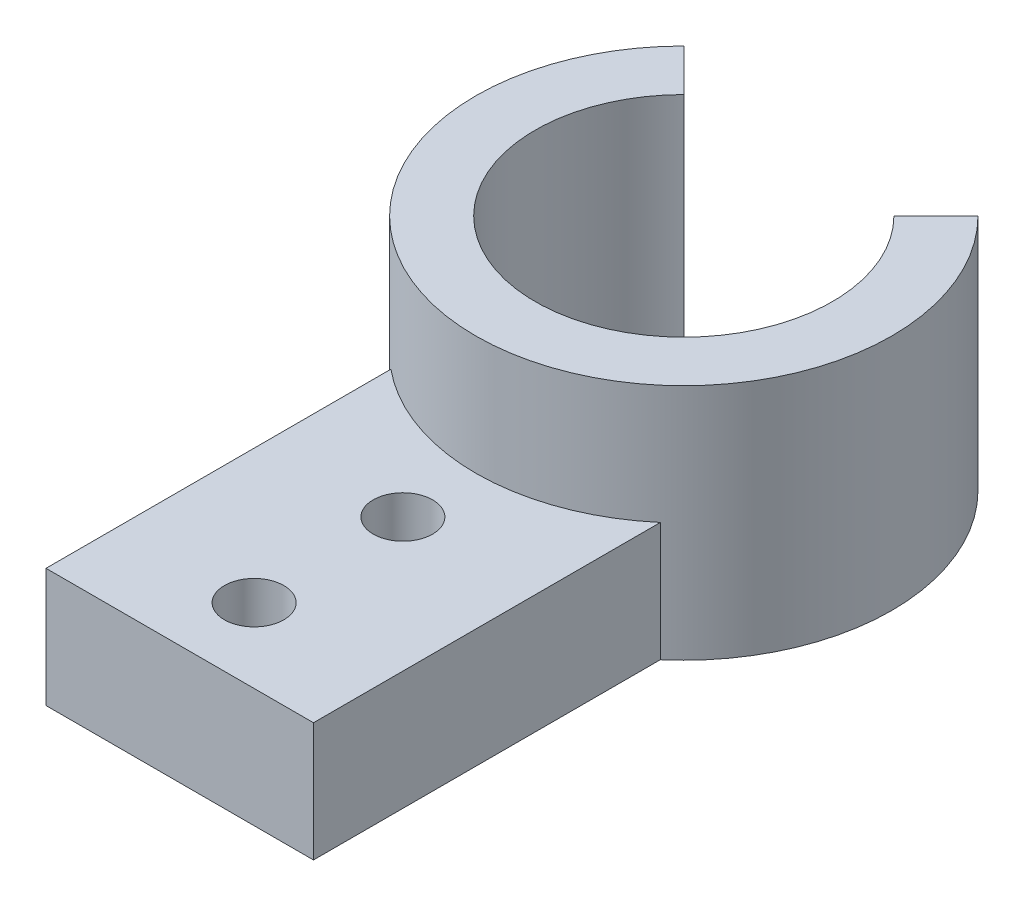
ISO-10303-21;
HEADER;
FILE_DESCRIPTION(('STEP AP214'),'2;1');
FILE_NAME('part.step','',(''),(''),'','','');
FILE_SCHEMA(('AUTOMOTIVE_DESIGN { 1 0 10303 214 1 1 1 1 }'));
ENDSEC;
DATA;
#1=APPLICATION_CONTEXT('core data for automotive mechanical design processes');
#2=APPLICATION_PROTOCOL_DEFINITION('international standard','automotive_design',2000,#1);
#3=PRODUCT_CONTEXT('',#1,'mechanical');
#4=PRODUCT('Part','Part','',(#3));
#5=PRODUCT_RELATED_PRODUCT_CATEGORY('part','',(#4));
#6=PRODUCT_DEFINITION_FORMATION('','',#4);
#7=PRODUCT_DEFINITION_CONTEXT('part definition',#1,'design');
#8=PRODUCT_DEFINITION('design','',#6,#7);
#9=PRODUCT_DEFINITION_SHAPE('','',#8);
#10=(LENGTH_UNIT() NAMED_UNIT(*) SI_UNIT(.MILLI.,.METRE.));
#11=(NAMED_UNIT(*) PLANE_ANGLE_UNIT() SI_UNIT($,.RADIAN.));
#12=(NAMED_UNIT(*) SI_UNIT($,.STERADIAN.) SOLID_ANGLE_UNIT());
#13=UNCERTAINTY_MEASURE_WITH_UNIT(LENGTH_MEASURE(1.E-05),#10,'distance_accuracy_value','');
#14=(GEOMETRIC_REPRESENTATION_CONTEXT(3) GLOBAL_UNCERTAINTY_ASSIGNED_CONTEXT((#13)) GLOBAL_UNIT_ASSIGNED_CONTEXT((#10,
#11,#12)) REPRESENTATION_CONTEXT('',''));
#15=CARTESIAN_POINT('',(0.,0.,0.));
#16=DIRECTION('',(0.,0.,1.));
#17=DIRECTION('',(1.,0.,0.));
#18=AXIS2_PLACEMENT_3D('',#15,#16,#17);
#19=CARTESIAN_POINT('',(0.,8.,0.));
#20=DIRECTION('',(0.,-1.,0.));
#21=DIRECTION('',(0.,0.,-1.));
#22=AXIS2_PLACEMENT_3D('',#19,#20,#21);
#23=CYLINDRICAL_SURFACE('',#22,7.);
#24=DIRECTION('',(0.,-1.,0.));
#25=VECTOR('',#24,1.);
#26=CARTESIAN_POINT('',(4.5396703691316,8.,5.32835743354634));
#27=LINE('',#26,#25);
#28=CARTESIAN_POINT('',(4.5396703691316,0.,5.32835743354634));
#29=VERTEX_POINT('',#28);
#30=CARTESIAN_POINT('',(4.5396703691316,4.,5.32835743354634));
#31=VERTEX_POINT('',#30);
#32=EDGE_CURVE('E134',#29,#31,#27,.F.);
#33=ORIENTED_EDGE('',*,*,#32,.F.);
#34=CARTESIAN_POINT('',(0.,0.,0.));
#35=DIRECTION('',(0.,1.,0.));
#36=DIRECTION('',(0.,0.,1.));
#37=AXIS2_PLACEMENT_3D('',#34,#35,#36);
#38=CIRCLE('',#37,7.);
#39=CARTESIAN_POINT('',(4.94974746830581,0.,-4.94974746830586));
#40=VERTEX_POINT('',#39);
#41=EDGE_CURVE('E156',#29,#40,#38,.T.);
#42=ORIENTED_EDGE('',*,*,#41,.T.);
#43=DIRECTION('',(0.,-1.,0.));
#44=VECTOR('',#43,1.);
#45=CARTESIAN_POINT('',(4.94974746830581,8.,-4.94974746830586));
#46=LINE('',#45,#44);
#47=CARTESIAN_POINT('',(4.94974746830581,8.,-4.94974746830586));
#48=VERTEX_POINT('',#47);
#49=EDGE_CURVE('E149',#40,#48,#46,.F.);
#50=ORIENTED_EDGE('',*,*,#49,.T.);
#51=CARTESIAN_POINT('',(0.,8.,0.));
#52=DIRECTION('',(0.,1.,0.));
#53=DIRECTION('',(0.,0.,1.));
#54=AXIS2_PLACEMENT_3D('',#51,#52,#53);
#55=CIRCLE('',#54,7.);
#56=CARTESIAN_POINT('',(-4.94974746830586,8.,-4.94974746830581));
#57=VERTEX_POINT('',#56);
#58=EDGE_CURVE('E158',#57,#48,#55,.T.);
#59=ORIENTED_EDGE('',*,*,#58,.F.);
#60=DIRECTION('',(0.,-1.,0.));
#61=VECTOR('',#60,1.);
#62=CARTESIAN_POINT('',(-4.94974746830586,8.,-4.94974746830581));
#63=LINE('',#62,#61);
#64=CARTESIAN_POINT('',(-4.94974746830586,0.,-4.94974746830581));
#65=VERTEX_POINT('',#64);
#66=EDGE_CURVE('E144',#57,#65,#63,.T.);
#67=ORIENTED_EDGE('',*,*,#66,.T.);
#68=CARTESIAN_POINT('',(-4.4603296308684,0.,5.39494759789169));
#69=VERTEX_POINT('',#68);
#70=EDGE_CURVE('E161',#65,#69,#38,.T.);
#71=ORIENTED_EDGE('',*,*,#70,.T.);
#72=DIRECTION('',(0.,-1.,0.));
#73=VECTOR('',#72,1.);
#74=CARTESIAN_POINT('',(-4.4603296308684,8.,5.3949475978917));
#75=LINE('',#74,#73);
#76=CARTESIAN_POINT('',(-4.4603296308684,4.,5.3949475978917));
#77=VERTEX_POINT('',#76);
#78=EDGE_CURVE('E132',#77,#69,#75,.T.);
#79=ORIENTED_EDGE('',*,*,#78,.F.);
#80=CARTESIAN_POINT('',(0.,4.,0.));
#81=DIRECTION('',(0.,-1.,0.));
#82=DIRECTION('',(0.,0.,-1.));
#83=AXIS2_PLACEMENT_3D('',#80,#81,#82);
#84=CIRCLE('',#83,7.);
#85=EDGE_CURVE('E51',#31,#77,#84,.T.);
#86=ORIENTED_EDGE('',*,*,#85,.F.);
#87=EDGE_LOOP('',(#33,#42,#50,#59,#67,#71,#79,#86));
#88=FACE_BOUND('',#87,.T.);
#89=ADVANCED_FACE('F37',(#88),#23,.T.);
#90=CARTESIAN_POINT('',(0.,8.,0.));
#91=DIRECTION('',(0.,1.,0.));
#92=DIRECTION('',(0.,0.,1.));
#93=AXIS2_PLACEMENT_3D('',#90,#91,#92);
#94=PLANE('',#93);
#95=DIRECTION('',(0.707106781186544,0.,-0.707106781186551));
#96=VECTOR('',#95,1.);
#97=CARTESIAN_POINT('',(8.5264457854819,8.,-8.52644578548199));
#98=LINE('',#97,#96);
#99=CARTESIAN_POINT('',(3.53553390593272,8.,-3.53553390593275));
#100=VERTEX_POINT('',#99);
#101=EDGE_CURVE('E136',#100,#48,#98,.T.);
#102=ORIENTED_EDGE('',*,*,#101,.F.);
#103=CARTESIAN_POINT('',(0.,8.,0.));
#104=DIRECTION('',(0.,1.,0.));
#105=DIRECTION('',(0.,0.,1.));
#106=AXIS2_PLACEMENT_3D('',#103,#104,#105);
#107=CIRCLE('',#106,5.);
#108=CARTESIAN_POINT('',(-3.53553390593276,8.,-3.53553390593272));
#109=VERTEX_POINT('',#108);
#110=EDGE_CURVE('E153',#109,#100,#107,.T.);
#111=ORIENTED_EDGE('',*,*,#110,.F.);
#112=DIRECTION('',(0.707106781186551,0.,0.707106781186544));
#113=VECTOR('',#112,1.);
#114=CARTESIAN_POINT('',(0.,8.,0.));
#115=LINE('',#114,#113);
#116=EDGE_CURVE('E141',#57,#109,#115,.T.);
#117=ORIENTED_EDGE('',*,*,#116,.F.);
#118=ORIENTED_EDGE('',*,*,#58,.T.);
#119=EDGE_LOOP('',(#102,#111,#117,#118));
#120=FACE_BOUND('',#119,.T.);
#121=ADVANCED_FACE('F180',(#120),#94,.T.);
#122=CARTESIAN_POINT('',(0.,0.,0.));
#123=DIRECTION('',(0.,1.,0.));
#124=DIRECTION('',(0.,0.,1.));
#125=AXIS2_PLACEMENT_3D('',#122,#123,#124);
#126=PLANE('',#125);
#127=CARTESIAN_POINT('',(0.0487607335645149,0.,9.49990420223597));
#128=DIRECTION('',(0.,1.,0.));
#129=DIRECTION('',(0.,0.,1.));
#130=AXIS2_PLACEMENT_3D('',#127,#128,#129);
#131=CIRCLE('',#130,1.);
#132=CARTESIAN_POINT('',(0.0487607335645149,0.,10.499904202236));
#133=VERTEX_POINT('',#132);
#134=EDGE_CURVE('E123',#133,#133,#131,.T.);
#135=ORIENTED_EDGE('',*,*,#134,.T.);
#136=EDGE_LOOP('',(#135));
#137=FACE_BOUND('',#136,.T.);
#138=CARTESIAN_POINT('',(0.0427005680159457,0.,14.499904202236));
#139=DIRECTION('',(0.,1.,0.));
#140=DIRECTION('',(0.,0.,1.));
#141=AXIS2_PLACEMENT_3D('',#138,#139,#140);
#142=CIRCLE('',#141,1.);
#143=CARTESIAN_POINT('',(0.0427005680159457,0.,15.499904202236));
#144=VERTEX_POINT('',#143);
#145=EDGE_CURVE('E224',#144,#144,#142,.T.);
#146=ORIENTED_EDGE('',*,*,#145,.T.);
#147=EDGE_LOOP('',(#146));
#148=FACE_BOUND('',#147,.T.);
#149=CARTESIAN_POINT('',(0.,0.,0.));
#150=DIRECTION('',(0.,1.,0.));
#151=DIRECTION('',(0.,0.,1.));
#152=AXIS2_PLACEMENT_3D('',#149,#150,#151);
#153=CIRCLE('',#152,5.);
#154=CARTESIAN_POINT('',(-3.53553390593276,0.,-3.53553390593272));
#155=VERTEX_POINT('',#154);
#156=CARTESIAN_POINT('',(3.53553390593272,0.,-3.53553390593276));
#157=VERTEX_POINT('',#156);
#158=EDGE_CURVE('E152',#155,#157,#153,.T.);
#159=ORIENTED_EDGE('',*,*,#158,.T.);
#160=DIRECTION('',(0.707106781186544,0.,-0.707106781186551));
#161=VECTOR('',#160,1.);
#162=CARTESIAN_POINT('',(8.5264457854819,0.,-8.52644578548199));
#163=LINE('',#162,#161);
#164=EDGE_CURVE('E137',#157,#40,#163,.T.);
#165=ORIENTED_EDGE('',*,*,#164,.T.);
#166=ORIENTED_EDGE('',*,*,#41,.F.);
#167=DIRECTION('',(0.,0.,1.));
#168=VECTOR('',#167,1.);
#169=CARTESIAN_POINT('',(4.5396703691316,0.,-4.95074746830586));
#170=LINE('',#169,#168);
#171=CARTESIAN_POINT('',(4.5396703691316,0.,17.));
#172=VERTEX_POINT('',#171);
#173=EDGE_CURVE('E105',#29,#172,#170,.T.);
#174=ORIENTED_EDGE('',*,*,#173,.T.);
#175=DIRECTION('',(1.,0.,0.));
#176=VECTOR('',#175,1.);
#177=CARTESIAN_POINT('',(-4.4603296308684,0.,17.));
#178=LINE('',#177,#176);
#179=CARTESIAN_POINT('',(-4.4603296308684,0.,17.));
#180=VERTEX_POINT('',#179);
#181=EDGE_CURVE('E120',#180,#172,#178,.T.);
#182=ORIENTED_EDGE('',*,*,#181,.F.);
#183=DIRECTION('',(0.,0.,1.));
#184=VECTOR('',#183,1.);
#185=CARTESIAN_POINT('',(-4.4603296308684,0.,-4.95074746830586));
#186=LINE('',#185,#184);
#187=EDGE_CURVE('E106',#69,#180,#186,.T.);
#188=ORIENTED_EDGE('',*,*,#187,.F.);
#189=ORIENTED_EDGE('',*,*,#70,.F.);
#190=DIRECTION('',(0.707106781186551,0.,0.707106781186544));
#191=VECTOR('',#190,1.);
#192=CARTESIAN_POINT('',(-4.94974746830586,0.,-4.94974746830581));
#193=LINE('',#192,#191);
#194=EDGE_CURVE('E140',#65,#155,#193,.T.);
#195=ORIENTED_EDGE('',*,*,#194,.T.);
#196=EDGE_LOOP('',(#159,#165,#166,#174,#182,#188,#189,#195));
#197=FACE_BOUND('',#196,.T.);
#198=ADVANCED_FACE('F171',(#137,#148,#197),#126,.F.);
#199=CARTESIAN_POINT('',(0.,8.,0.));
#200=DIRECTION('',(0.,-1.,0.));
#201=DIRECTION('',(0.,0.,-1.));
#202=AXIS2_PLACEMENT_3D('',#199,#200,#201);
#203=CYLINDRICAL_SURFACE('',#202,5.);
#204=DIRECTION('',(0.,-1.,0.));
#205=VECTOR('',#204,1.);
#206=CARTESIAN_POINT('',(3.53553390593272,8.,-3.53553390593276));
#207=LINE('',#206,#205);
#208=EDGE_CURVE('E11',#157,#100,#207,.F.);
#209=ORIENTED_EDGE('',*,*,#208,.F.);
#210=ORIENTED_EDGE('',*,*,#158,.F.);
#211=DIRECTION('',(0.,-1.,0.));
#212=VECTOR('',#211,1.);
#213=CARTESIAN_POINT('',(-3.53553390593276,8.,-3.53553390593272));
#214=LINE('',#213,#212);
#215=EDGE_CURVE('E44',#109,#155,#214,.T.);
#216=ORIENTED_EDGE('',*,*,#215,.F.);
#217=ORIENTED_EDGE('',*,*,#110,.T.);
#218=EDGE_LOOP('',(#209,#210,#216,#217));
#219=FACE_BOUND('',#218,.T.);
#220=ADVANCED_FACE('F174',(#219),#203,.F.);
#221=CARTESIAN_POINT('',(0.,0.,0.));
#222=DIRECTION('',(-0.707106781186544,0.,0.707106781186551));
#223=DIRECTION('',(0.707106781186551,0.,0.707106781186544));
#224=AXIS2_PLACEMENT_3D('',#221,#222,#223);
#225=PLANE('',#224);
#226=ORIENTED_EDGE('',*,*,#116,.T.);
#227=ORIENTED_EDGE('',*,*,#215,.T.);
#228=ORIENTED_EDGE('',*,*,#194,.F.);
#229=ORIENTED_EDGE('',*,*,#66,.F.);
#230=EDGE_LOOP('',(#226,#227,#228,#229));
#231=FACE_BOUND('',#230,.T.);
#232=ADVANCED_FACE('F164',(#231),#225,.F.);
#233=CARTESIAN_POINT('',(8.5264457854819,0.,-8.52644578548199));
#234=DIRECTION('',(0.707106781186551,0.,0.707106781186544));
#235=DIRECTION('',(0.707106781186544,0.,-0.707106781186551));
#236=AXIS2_PLACEMENT_3D('',#233,#234,#235);
#237=PLANE('',#236);
#238=ORIENTED_EDGE('',*,*,#164,.F.);
#239=ORIENTED_EDGE('',*,*,#208,.T.);
#240=ORIENTED_EDGE('',*,*,#101,.T.);
#241=ORIENTED_EDGE('',*,*,#49,.F.);
#242=EDGE_LOOP('',(#238,#239,#240,#241));
#243=FACE_BOUND('',#242,.T.);
#244=ADVANCED_FACE('F177',(#243),#237,.F.);
#245=CARTESIAN_POINT('',(4.5396703691316,4.,-4.95074746830586));
#246=DIRECTION('',(-1.,0.,0.));
#247=DIRECTION('',(0.,0.,1.));
#248=AXIS2_PLACEMENT_3D('',#245,#246,#247);
#249=PLANE('',#248);
#250=ORIENTED_EDGE('',*,*,#173,.F.);
#251=ORIENTED_EDGE('',*,*,#32,.T.);
#252=DIRECTION('',(0.,0.,1.));
#253=VECTOR('',#252,1.);
#254=CARTESIAN_POINT('',(4.5396703691316,4.,-4.95074746830586));
#255=LINE('',#254,#253);
#256=CARTESIAN_POINT('',(4.5396703691316,4.,17.));
#257=VERTEX_POINT('',#256);
#258=EDGE_CURVE('E115',#31,#257,#255,.T.);
#259=ORIENTED_EDGE('',*,*,#258,.T.);
#260=DIRECTION('',(0.,-1.,0.));
#261=VECTOR('',#260,1.);
#262=CARTESIAN_POINT('',(4.5396703691316,4.,17.));
#263=LINE('',#262,#261);
#264=EDGE_CURVE('E116',#257,#172,#263,.T.);
#265=ORIENTED_EDGE('',*,*,#264,.T.);
#266=EDGE_LOOP('',(#250,#251,#259,#265));
#267=FACE_BOUND('',#266,.T.);
#268=ADVANCED_FACE('F185',(#267),#249,.F.);
#269=CARTESIAN_POINT('',(-4.4603296308684,4.,-4.95074746830586));
#270=DIRECTION('',(1.,0.,0.));
#271=DIRECTION('',(0.,1.,0.));
#272=AXIS2_PLACEMENT_3D('',#269,#270,#271);
#273=PLANE('',#272);
#274=DIRECTION('',(0.,0.,1.));
#275=VECTOR('',#274,1.);
#276=CARTESIAN_POINT('',(-4.4603296308684,4.,-4.95074746830586));
#277=LINE('',#276,#275);
#278=CARTESIAN_POINT('',(-4.4603296308684,4.,17.));
#279=VERTEX_POINT('',#278);
#280=EDGE_CURVE('E97',#77,#279,#277,.T.);
#281=ORIENTED_EDGE('',*,*,#280,.F.);
#282=ORIENTED_EDGE('',*,*,#78,.T.);
#283=ORIENTED_EDGE('',*,*,#187,.T.);
#284=DIRECTION('',(0.,-1.,0.));
#285=VECTOR('',#284,1.);
#286=CARTESIAN_POINT('',(-4.4603296308684,4.,17.));
#287=LINE('',#286,#285);
#288=EDGE_CURVE('E109',#279,#180,#287,.T.);
#289=ORIENTED_EDGE('',*,*,#288,.F.);
#290=EDGE_LOOP('',(#281,#282,#283,#289));
#291=FACE_BOUND('',#290,.T.);
#292=ADVANCED_FACE('F110',(#291),#273,.F.);
#293=CARTESIAN_POINT('',(4.5396703691316,4.,-4.95074746830586));
#294=DIRECTION('',(0.,-1.,0.));
#295=DIRECTION('',(0.,0.,-1.));
#296=AXIS2_PLACEMENT_3D('',#293,#294,#295);
#297=PLANE('',#296);
#298=CARTESIAN_POINT('',(0.0487607335645149,4.,9.49990420223597));
#299=DIRECTION('',(0.,1.,0.));
#300=DIRECTION('',(0.,0.,1.));
#301=AXIS2_PLACEMENT_3D('',#298,#299,#300);
#302=CIRCLE('',#301,1.);
#303=CARTESIAN_POINT('',(0.0487607335645149,4.,10.499904202236));
#304=VERTEX_POINT('',#303);
#305=EDGE_CURVE('E218',#304,#304,#302,.T.);
#306=ORIENTED_EDGE('',*,*,#305,.F.);
#307=EDGE_LOOP('',(#306));
#308=FACE_BOUND('',#307,.T.);
#309=CARTESIAN_POINT('',(0.0427005680159457,4.,14.499904202236));
#310=DIRECTION('',(0.,1.,0.));
#311=DIRECTION('',(0.,0.,1.));
#312=AXIS2_PLACEMENT_3D('',#309,#310,#311);
#313=CIRCLE('',#312,1.);
#314=CARTESIAN_POINT('',(0.0427005680159457,4.,15.499904202236));
#315=VERTEX_POINT('',#314);
#316=EDGE_CURVE('E221',#315,#315,#313,.T.);
#317=ORIENTED_EDGE('',*,*,#316,.F.);
#318=EDGE_LOOP('',(#317));
#319=FACE_BOUND('',#318,.T.);
#320=ORIENTED_EDGE('',*,*,#258,.F.);
#321=ORIENTED_EDGE('',*,*,#85,.T.);
#322=ORIENTED_EDGE('',*,*,#280,.T.);
#323=DIRECTION('',(1.,0.,0.));
#324=VECTOR('',#323,1.);
#325=CARTESIAN_POINT('',(-4.4603296308684,4.,17.));
#326=LINE('',#325,#324);
#327=EDGE_CURVE('E101',#279,#257,#326,.T.);
#328=ORIENTED_EDGE('',*,*,#327,.T.);
#329=EDGE_LOOP('',(#320,#321,#322,#328));
#330=FACE_BOUND('',#329,.T.);
#331=ADVANCED_FACE('F99',(#308,#319,#330),#297,.F.);
#332=CARTESIAN_POINT('',(-4.4603296308684,4.,17.));
#333=DIRECTION('',(0.,0.,-1.));
#334=DIRECTION('',(-1.,0.,0.));
#335=AXIS2_PLACEMENT_3D('',#332,#333,#334);
#336=PLANE('',#335);
#337=ORIENTED_EDGE('',*,*,#181,.T.);
#338=ORIENTED_EDGE('',*,*,#264,.F.);
#339=ORIENTED_EDGE('',*,*,#327,.F.);
#340=ORIENTED_EDGE('',*,*,#288,.T.);
#341=EDGE_LOOP('',(#337,#338,#339,#340));
#342=FACE_BOUND('',#341,.T.);
#343=ADVANCED_FACE('F118',(#342),#336,.F.);
#344=CARTESIAN_POINT('',(0.0427005680159457,-4.,14.499904202236));
#345=DIRECTION('',(0.,1.,0.));
#346=DIRECTION('',(0.,0.,1.));
#347=AXIS2_PLACEMENT_3D('',#344,#345,#346);
#348=CYLINDRICAL_SURFACE('',#347,1.);
#349=ORIENTED_EDGE('',*,*,#316,.T.);
#350=EDGE_LOOP('',(#349));
#351=FACE_BOUND('',#350,.T.);
#352=ORIENTED_EDGE('',*,*,#145,.F.);
#353=EDGE_LOOP('',(#352));
#354=FACE_BOUND('',#353,.T.);
#355=ADVANCED_FACE('F214',(#351,#354),#348,.F.);
#356=CARTESIAN_POINT('',(0.0487607335645149,-4.,9.49990420223597));
#357=DIRECTION('',(0.,1.,0.));
#358=DIRECTION('',(0.,0.,1.));
#359=AXIS2_PLACEMENT_3D('',#356,#357,#358);
#360=CYLINDRICAL_SURFACE('',#359,1.);
#361=ORIENTED_EDGE('',*,*,#305,.T.);
#362=EDGE_LOOP('',(#361));
#363=FACE_BOUND('',#362,.T.);
#364=ORIENTED_EDGE('',*,*,#134,.F.);
#365=EDGE_LOOP('',(#364));
#366=FACE_BOUND('',#365,.T.);
#367=ADVANCED_FACE('F232',(#363,#366),#360,.F.);
#368=CLOSED_SHELL('',(#89,#121,#198,#220,#232,#244,#268,#292,#331,#343,#355,#367));
#369=MANIFOLD_SOLID_BREP('B2',#368);
#370=ADVANCED_BREP_SHAPE_REPRESENTATION('',(#18,#369),#14);
#371=SHAPE_DEFINITION_REPRESENTATION(#9,#370);
ENDSEC;
END-ISO-10303-21;
